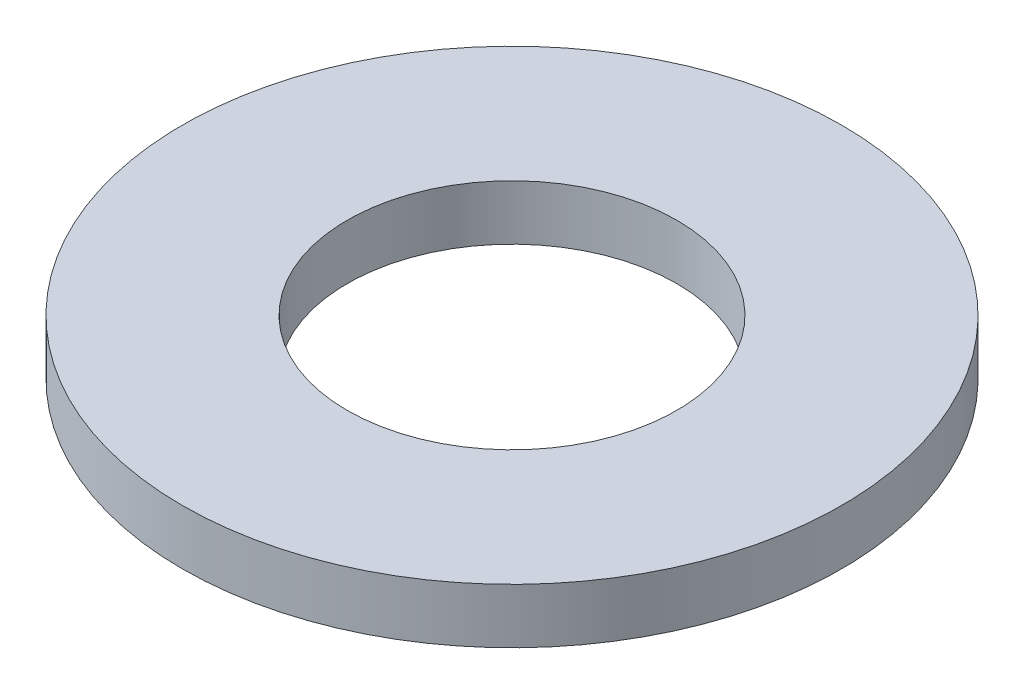
ISO-10303-21;
HEADER;
FILE_DESCRIPTION(('STEP AP214'),'2;1');
FILE_NAME('part.step','',(''),(''),'','','');
FILE_SCHEMA(('AUTOMOTIVE_DESIGN { 1 0 10303 214 1 1 1 1 }'));
ENDSEC;
DATA;
#1=APPLICATION_CONTEXT('core data for automotive mechanical design processes');
#2=APPLICATION_PROTOCOL_DEFINITION('international standard','automotive_design',2000,#1);
#3=PRODUCT_CONTEXT('',#1,'mechanical');
#4=PRODUCT('Part','Part','',(#3));
#5=PRODUCT_RELATED_PRODUCT_CATEGORY('part','',(#4));
#6=PRODUCT_DEFINITION_FORMATION('','',#4);
#7=PRODUCT_DEFINITION_CONTEXT('part definition',#1,'design');
#8=PRODUCT_DEFINITION('design','',#6,#7);
#9=PRODUCT_DEFINITION_SHAPE('','',#8);
#10=(LENGTH_UNIT() NAMED_UNIT(*) SI_UNIT(.MILLI.,.METRE.));
#11=(NAMED_UNIT(*) PLANE_ANGLE_UNIT() SI_UNIT($,.RADIAN.));
#12=(NAMED_UNIT(*) SI_UNIT($,.STERADIAN.) SOLID_ANGLE_UNIT());
#13=UNCERTAINTY_MEASURE_WITH_UNIT(LENGTH_MEASURE(1.E-05),#10,'distance_accuracy_value','');
#14=(GEOMETRIC_REPRESENTATION_CONTEXT(3) GLOBAL_UNCERTAINTY_ASSIGNED_CONTEXT((#13)) GLOBAL_UNIT_ASSIGNED_CONTEXT((#10,
#11,#12)) REPRESENTATION_CONTEXT('',''));
#15=CARTESIAN_POINT('',(0.,0.,0.));
#16=DIRECTION('',(0.,0.,1.));
#17=DIRECTION('',(1.,0.,0.));
#18=AXIS2_PLACEMENT_3D('',#15,#16,#17);
#19=CARTESIAN_POINT('',(0.,2.54,0.));
#20=DIRECTION('',(0.,1.,0.));
#21=DIRECTION('',(0.,0.,1.));
#22=AXIS2_PLACEMENT_3D('',#19,#20,#21);
#23=PLANE('',#22);
#24=CARTESIAN_POINT('',(0.,2.54,0.));
#25=DIRECTION('',(0.,1.,0.));
#26=DIRECTION('',(0.,0.,1.));
#27=AXIS2_PLACEMENT_3D('',#24,#25,#26);
#28=CIRCLE('',#27,15.24);
#29=CARTESIAN_POINT('',(0.,2.54,15.24));
#30=VERTEX_POINT('',#29);
#31=EDGE_CURVE('E11',#30,#30,#28,.T.);
#32=ORIENTED_EDGE('',*,*,#31,.T.);
#33=EDGE_LOOP('',(#32));
#34=FACE_BOUND('',#33,.T.);
#35=CARTESIAN_POINT('',(0.,2.54,0.));
#36=DIRECTION('',(0.,1.,0.));
#37=DIRECTION('',(0.,0.,1.));
#38=AXIS2_PLACEMENT_3D('',#35,#36,#37);
#39=CIRCLE('',#38,7.62);
#40=CARTESIAN_POINT('',(0.,2.54,7.62));
#41=VERTEX_POINT('',#40);
#42=EDGE_CURVE('E47',#41,#41,#39,.T.);
#43=ORIENTED_EDGE('',*,*,#42,.F.);
#44=EDGE_LOOP('',(#43));
#45=FACE_BOUND('',#44,.T.);
#46=ADVANCED_FACE('F36',(#34,#45),#23,.T.);
#47=CARTESIAN_POINT('',(0.,0.,0.));
#48=DIRECTION('',(0.,1.,0.));
#49=DIRECTION('',(0.,0.,1.));
#50=AXIS2_PLACEMENT_3D('',#47,#48,#49);
#51=PLANE('',#50);
#52=CARTESIAN_POINT('',(0.,0.,0.));
#53=DIRECTION('',(0.,1.,0.));
#54=DIRECTION('',(0.,0.,1.));
#55=AXIS2_PLACEMENT_3D('',#52,#53,#54);
#56=CIRCLE('',#55,15.24);
#57=CARTESIAN_POINT('',(0.,0.,15.24));
#58=VERTEX_POINT('',#57);
#59=EDGE_CURVE('E40',#58,#58,#56,.T.);
#60=ORIENTED_EDGE('',*,*,#59,.F.);
#61=EDGE_LOOP('',(#60));
#62=FACE_BOUND('',#61,.T.);
#63=CARTESIAN_POINT('',(0.,0.,0.));
#64=DIRECTION('',(0.,1.,0.));
#65=DIRECTION('',(0.,0.,1.));
#66=AXIS2_PLACEMENT_3D('',#63,#64,#65);
#67=CIRCLE('',#66,7.62);
#68=CARTESIAN_POINT('',(0.,0.,7.62));
#69=VERTEX_POINT('',#68);
#70=EDGE_CURVE('E49',#69,#69,#67,.T.);
#71=ORIENTED_EDGE('',*,*,#70,.T.);
#72=EDGE_LOOP('',(#71));
#73=FACE_BOUND('',#72,.T.);
#74=ADVANCED_FACE('F59',(#62,#73),#51,.F.);
#75=CARTESIAN_POINT('',(0.,2.54,0.));
#76=DIRECTION('',(0.,-1.,0.));
#77=DIRECTION('',(0.,0.,-1.));
#78=AXIS2_PLACEMENT_3D('',#75,#76,#77);
#79=CYLINDRICAL_SURFACE('',#78,15.24);
#80=ORIENTED_EDGE('',*,*,#31,.F.);
#81=EDGE_LOOP('',(#80));
#82=FACE_BOUND('',#81,.T.);
#83=ORIENTED_EDGE('',*,*,#59,.T.);
#84=EDGE_LOOP('',(#83));
#85=FACE_BOUND('',#84,.T.);
#86=ADVANCED_FACE('F38',(#82,#85),#79,.T.);
#87=CARTESIAN_POINT('',(0.,2.54,0.));
#88=DIRECTION('',(0.,-1.,0.));
#89=DIRECTION('',(0.,0.,-1.));
#90=AXIS2_PLACEMENT_3D('',#87,#88,#89);
#91=CYLINDRICAL_SURFACE('',#90,7.62);
#92=ORIENTED_EDGE('',*,*,#42,.T.);
#93=EDGE_LOOP('',(#92));
#94=FACE_BOUND('',#93,.T.);
#95=ORIENTED_EDGE('',*,*,#70,.F.);
#96=EDGE_LOOP('',(#95));
#97=FACE_BOUND('',#96,.T.);
#98=ADVANCED_FACE('F55',(#94,#97),#91,.F.);
#99=CLOSED_SHELL('',(#46,#74,#86,#98));
#100=MANIFOLD_SOLID_BREP('B2',#99);
#101=ADVANCED_BREP_SHAPE_REPRESENTATION('',(#18,#100),#14);
#102=SHAPE_DEFINITION_REPRESENTATION(#9,#101);
ENDSEC;
END-ISO-10303-21;
